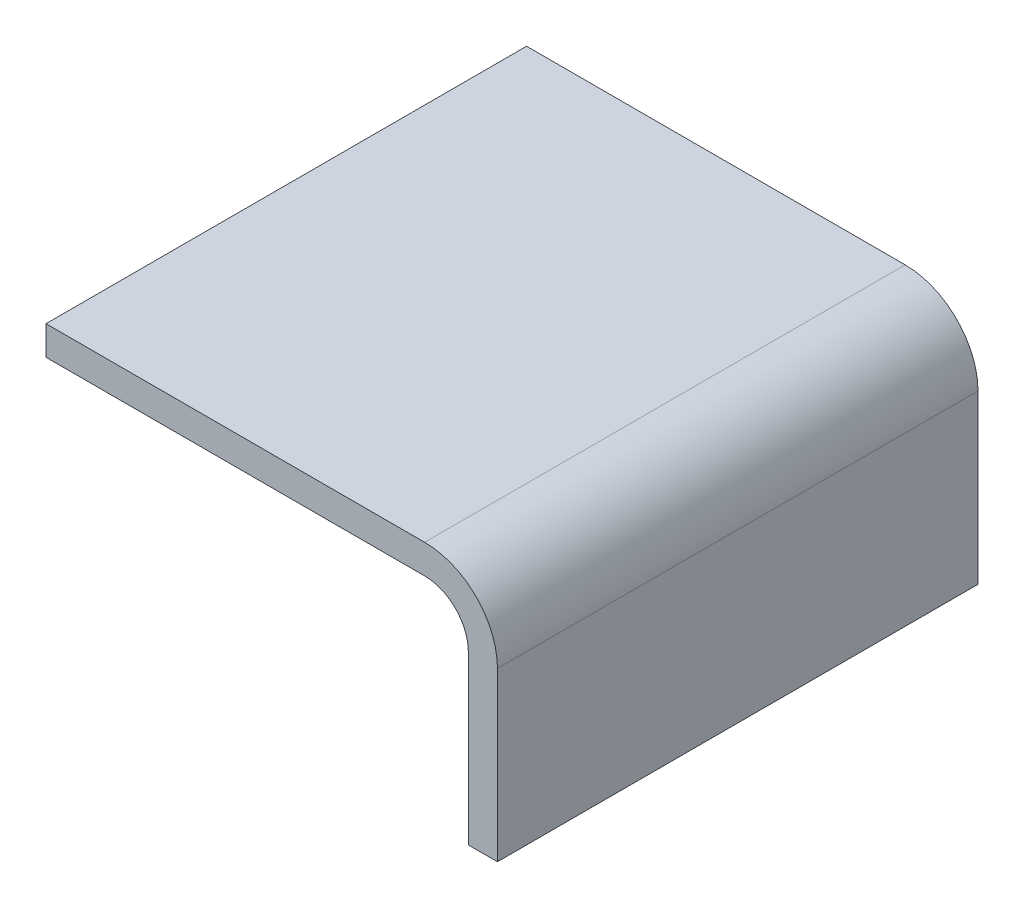
ISO-10303-21;
HEADER;
FILE_DESCRIPTION(('STEP AP214'),'2;1');
FILE_NAME('part.step','',(''),(''),'','','');
FILE_SCHEMA(('AUTOMOTIVE_DESIGN { 1 0 10303 214 1 1 1 1 }'));
ENDSEC;
DATA;
#1=APPLICATION_CONTEXT('core data for automotive mechanical design processes');
#2=APPLICATION_PROTOCOL_DEFINITION('international standard','automotive_design',2000,#1);
#3=PRODUCT_CONTEXT('',#1,'mechanical');
#4=PRODUCT('Part','Part','',(#3));
#5=PRODUCT_RELATED_PRODUCT_CATEGORY('part','',(#4));
#6=PRODUCT_DEFINITION_FORMATION('','',#4);
#7=PRODUCT_DEFINITION_CONTEXT('part definition',#1,'design');
#8=PRODUCT_DEFINITION('design','',#6,#7);
#9=PRODUCT_DEFINITION_SHAPE('','',#8);
#10=(LENGTH_UNIT() NAMED_UNIT(*) SI_UNIT(.MILLI.,.METRE.));
#11=(NAMED_UNIT(*) PLANE_ANGLE_UNIT() SI_UNIT($,.RADIAN.));
#12=(NAMED_UNIT(*) SI_UNIT($,.STERADIAN.) SOLID_ANGLE_UNIT());
#13=UNCERTAINTY_MEASURE_WITH_UNIT(LENGTH_MEASURE(1.E-05),#10,'distance_accuracy_value','');
#14=(GEOMETRIC_REPRESENTATION_CONTEXT(3) GLOBAL_UNCERTAINTY_ASSIGNED_CONTEXT((#13)) GLOBAL_UNIT_ASSIGNED_CONTEXT((#10,
#11,#12)) REPRESENTATION_CONTEXT('',''));
#15=CARTESIAN_POINT('',(0.,0.,0.));
#16=DIRECTION('',(0.,0.,1.));
#17=DIRECTION('',(1.,0.,0.));
#18=AXIS2_PLACEMENT_3D('',#15,#16,#17);
#19=CARTESIAN_POINT('',(52.,23.,66.));
#20=DIRECTION('',(0.,0.,-1.));
#21=DIRECTION('',(-1.,0.,0.));
#22=AXIS2_PLACEMENT_3D('',#19,#20,#21);
#23=CYLINDRICAL_SURFACE('',#22,10.);
#24=CARTESIAN_POINT('',(52.,23.,0.));
#25=DIRECTION('',(0.,0.,1.));
#26=DIRECTION('',(-1.,0.,0.));
#27=AXIS2_PLACEMENT_3D('',#24,#25,#26);
#28=CIRCLE('',#27,10.);
#29=CARTESIAN_POINT('',(62.,22.9999999999999,0.));
#30=VERTEX_POINT('',#29);
#31=CARTESIAN_POINT('',(51.9999999999999,33.,0.));
#32=VERTEX_POINT('',#31);
#33=EDGE_CURVE('E130',#30,#32,#28,.T.);
#34=ORIENTED_EDGE('',*,*,#33,.T.);
#35=DIRECTION('',(0.,0.,-1.));
#36=VECTOR('',#35,1.);
#37=CARTESIAN_POINT('',(51.9999999999999,33.,66.));
#38=LINE('',#37,#36);
#39=CARTESIAN_POINT('',(51.9999999999999,33.,66.));
#40=VERTEX_POINT('',#39);
#41=EDGE_CURVE('E11',#40,#32,#38,.T.);
#42=ORIENTED_EDGE('',*,*,#41,.F.);
#43=CARTESIAN_POINT('',(52.,23.,66.));
#44=DIRECTION('',(0.,0.,1.));
#45=DIRECTION('',(-1.,0.,0.));
#46=AXIS2_PLACEMENT_3D('',#43,#44,#45);
#47=CIRCLE('',#46,10.);
#48=CARTESIAN_POINT('',(62.,22.9999999999999,66.));
#49=VERTEX_POINT('',#48);
#50=EDGE_CURVE('E144',#49,#40,#47,.T.);
#51=ORIENTED_EDGE('',*,*,#50,.F.);
#52=DIRECTION('',(0.,0.,-1.));
#53=VECTOR('',#52,1.);
#54=CARTESIAN_POINT('',(62.,22.9999999999999,66.));
#55=LINE('',#54,#53);
#56=EDGE_CURVE('E126',#49,#30,#55,.T.);
#57=ORIENTED_EDGE('',*,*,#56,.T.);
#58=EDGE_LOOP('',(#34,#42,#51,#57));
#59=FACE_BOUND('',#58,.T.);
#60=ADVANCED_FACE('F34',(#59),#23,.T.);
#61=CARTESIAN_POINT('',(0.,33.,66.));
#62=DIRECTION('',(0.,-1.,0.));
#63=DIRECTION('',(0.,0.,-1.));
#64=AXIS2_PLACEMENT_3D('',#61,#62,#63);
#65=PLANE('',#64);
#66=DIRECTION('',(-1.,0.,0.));
#67=VECTOR('',#66,1.);
#68=CARTESIAN_POINT('',(0.,33.,0.));
#69=LINE('',#68,#67);
#70=CARTESIAN_POINT('',(0.,33.,0.));
#71=VERTEX_POINT('',#70);
#72=EDGE_CURVE('E133',#32,#71,#69,.T.);
#73=ORIENTED_EDGE('',*,*,#72,.T.);
#74=DIRECTION('',(0.,0.,-1.));
#75=VECTOR('',#74,1.);
#76=CARTESIAN_POINT('',(0.,33.,66.));
#77=LINE('',#76,#75);
#78=CARTESIAN_POINT('',(0.,33.,66.));
#79=VERTEX_POINT('',#78);
#80=EDGE_CURVE('E42',#79,#71,#77,.T.);
#81=ORIENTED_EDGE('',*,*,#80,.F.);
#82=DIRECTION('',(-1.,0.,0.));
#83=VECTOR('',#82,1.);
#84=CARTESIAN_POINT('',(0.,33.,66.));
#85=LINE('',#84,#83);
#86=EDGE_CURVE('E93',#40,#79,#85,.T.);
#87=ORIENTED_EDGE('',*,*,#86,.F.);
#88=ORIENTED_EDGE('',*,*,#41,.T.);
#89=EDGE_LOOP('',(#73,#81,#87,#88));
#90=FACE_BOUND('',#89,.T.);
#91=ADVANCED_FACE('F179',(#90),#65,.F.);
#92=CARTESIAN_POINT('',(0.,33.,66.));
#93=DIRECTION('',(1.,0.,0.));
#94=DIRECTION('',(0.,0.,-1.));
#95=AXIS2_PLACEMENT_3D('',#92,#93,#94);
#96=PLANE('',#95);
#97=DIRECTION('',(0.,-1.,0.));
#98=VECTOR('',#97,1.);
#99=CARTESIAN_POINT('',(0.,33.,0.));
#100=LINE('',#99,#98);
#101=CARTESIAN_POINT('',(0.,29.,0.));
#102=VERTEX_POINT('',#101);
#103=EDGE_CURVE('E135',#71,#102,#100,.T.);
#104=ORIENTED_EDGE('',*,*,#103,.T.);
#105=DIRECTION('',(0.,0.,-1.));
#106=VECTOR('',#105,1.);
#107=CARTESIAN_POINT('',(0.,29.,66.));
#108=LINE('',#107,#106);
#109=CARTESIAN_POINT('',(0.,29.,66.));
#110=VERTEX_POINT('',#109);
#111=EDGE_CURVE('E151',#110,#102,#108,.T.);
#112=ORIENTED_EDGE('',*,*,#111,.F.);
#113=DIRECTION('',(0.,-1.,0.));
#114=VECTOR('',#113,1.);
#115=CARTESIAN_POINT('',(0.,33.,66.));
#116=LINE('',#115,#114);
#117=EDGE_CURVE('E159',#79,#110,#116,.T.);
#118=ORIENTED_EDGE('',*,*,#117,.F.);
#119=ORIENTED_EDGE('',*,*,#80,.T.);
#120=EDGE_LOOP('',(#104,#112,#118,#119));
#121=FACE_BOUND('',#120,.T.);
#122=ADVANCED_FACE('F157',(#121),#96,.F.);
#123=CARTESIAN_POINT('',(0.,29.,66.));
#124=DIRECTION('',(0.,1.,0.));
#125=DIRECTION('',(0.,0.,1.));
#126=AXIS2_PLACEMENT_3D('',#123,#124,#125);
#127=PLANE('',#126);
#128=DIRECTION('',(1.,0.,0.));
#129=VECTOR('',#128,1.);
#130=CARTESIAN_POINT('',(0.,29.,0.));
#131=LINE('',#130,#129);
#132=CARTESIAN_POINT('',(51.9999999999999,29.,0.));
#133=VERTEX_POINT('',#132);
#134=EDGE_CURVE('E137',#102,#133,#131,.T.);
#135=ORIENTED_EDGE('',*,*,#134,.T.);
#136=DIRECTION('',(0.,0.,-1.));
#137=VECTOR('',#136,1.);
#138=CARTESIAN_POINT('',(51.9999999999999,29.,66.));
#139=LINE('',#138,#137);
#140=CARTESIAN_POINT('',(51.9999999999999,29.,66.));
#141=VERTEX_POINT('',#140);
#142=EDGE_CURVE('E148',#141,#133,#139,.T.);
#143=ORIENTED_EDGE('',*,*,#142,.F.);
#144=DIRECTION('',(1.,0.,0.));
#145=VECTOR('',#144,1.);
#146=CARTESIAN_POINT('',(0.,29.,66.));
#147=LINE('',#146,#145);
#148=EDGE_CURVE('E171',#110,#141,#147,.T.);
#149=ORIENTED_EDGE('',*,*,#148,.F.);
#150=ORIENTED_EDGE('',*,*,#111,.T.);
#151=EDGE_LOOP('',(#135,#143,#149,#150));
#152=FACE_BOUND('',#151,.T.);
#153=ADVANCED_FACE('F167',(#152),#127,.F.);
#154=CARTESIAN_POINT('',(52.,23.,66.));
#155=DIRECTION('',(0.,0.,-1.));
#156=DIRECTION('',(-1.,0.,0.));
#157=AXIS2_PLACEMENT_3D('',#154,#155,#156);
#158=CYLINDRICAL_SURFACE('',#157,6.);
#159=CARTESIAN_POINT('',(52.,23.,0.));
#160=DIRECTION('',(0.,0.,-1.));
#161=DIRECTION('',(-1.,0.,0.));
#162=AXIS2_PLACEMENT_3D('',#159,#160,#161);
#163=CIRCLE('',#162,6.);
#164=CARTESIAN_POINT('',(58.,23.,0.));
#165=VERTEX_POINT('',#164);
#166=EDGE_CURVE('E139',#133,#165,#163,.T.);
#167=ORIENTED_EDGE('',*,*,#166,.T.);
#168=DIRECTION('',(0.,0.,-1.));
#169=VECTOR('',#168,1.);
#170=CARTESIAN_POINT('',(58.,23.,66.));
#171=LINE('',#170,#169);
#172=CARTESIAN_POINT('',(58.,23.,66.));
#173=VERTEX_POINT('',#172);
#174=EDGE_CURVE('E121',#173,#165,#171,.T.);
#175=ORIENTED_EDGE('',*,*,#174,.F.);
#176=CARTESIAN_POINT('',(52.,23.,66.));
#177=DIRECTION('',(0.,0.,-1.));
#178=DIRECTION('',(-1.,0.,0.));
#179=AXIS2_PLACEMENT_3D('',#176,#177,#178);
#180=CIRCLE('',#179,6.);
#181=EDGE_CURVE('E112',#141,#173,#180,.T.);
#182=ORIENTED_EDGE('',*,*,#181,.F.);
#183=ORIENTED_EDGE('',*,*,#142,.T.);
#184=EDGE_LOOP('',(#167,#175,#182,#183));
#185=FACE_BOUND('',#184,.T.);
#186=ADVANCED_FACE('F170',(#185),#158,.F.);
#187=CARTESIAN_POINT('',(58.,0.,66.));
#188=DIRECTION('',(1.,0.,0.));
#189=DIRECTION('',(0.,1.,0.));
#190=AXIS2_PLACEMENT_3D('',#187,#188,#189);
#191=PLANE('',#190);
#192=DIRECTION('',(0.,-1.,0.));
#193=VECTOR('',#192,1.);
#194=CARTESIAN_POINT('',(58.,0.,0.));
#195=LINE('',#194,#193);
#196=CARTESIAN_POINT('',(58.,0.,0.));
#197=VERTEX_POINT('',#196);
#198=EDGE_CURVE('E120',#165,#197,#195,.T.);
#199=ORIENTED_EDGE('',*,*,#198,.T.);
#200=DIRECTION('',(0.,0.,-1.));
#201=VECTOR('',#200,1.);
#202=CARTESIAN_POINT('',(58.,0.,66.));
#203=LINE('',#202,#201);
#204=CARTESIAN_POINT('',(58.,0.,66.));
#205=VERTEX_POINT('',#204);
#206=EDGE_CURVE('E117',#205,#197,#203,.T.);
#207=ORIENTED_EDGE('',*,*,#206,.F.);
#208=DIRECTION('',(0.,-1.,0.));
#209=VECTOR('',#208,1.);
#210=CARTESIAN_POINT('',(58.,0.,66.));
#211=LINE('',#210,#209);
#212=EDGE_CURVE('E106',#173,#205,#211,.T.);
#213=ORIENTED_EDGE('',*,*,#212,.F.);
#214=ORIENTED_EDGE('',*,*,#174,.T.);
#215=EDGE_LOOP('',(#199,#207,#213,#214));
#216=FACE_BOUND('',#215,.T.);
#217=ADVANCED_FACE('F118',(#216),#191,.F.);
#218=CARTESIAN_POINT('',(62.,0.,66.));
#219=DIRECTION('',(0.,1.,0.));
#220=DIRECTION('',(0.,0.,1.));
#221=AXIS2_PLACEMENT_3D('',#218,#219,#220);
#222=PLANE('',#221);
#223=DIRECTION('',(1.,0.,0.));
#224=VECTOR('',#223,1.);
#225=CARTESIAN_POINT('',(62.,0.,0.));
#226=LINE('',#225,#224);
#227=CARTESIAN_POINT('',(62.,0.,0.));
#228=VERTEX_POINT('',#227);
#229=EDGE_CURVE('E79',#197,#228,#226,.T.);
#230=ORIENTED_EDGE('',*,*,#229,.T.);
#231=DIRECTION('',(0.,0.,-1.));
#232=VECTOR('',#231,1.);
#233=CARTESIAN_POINT('',(62.,0.,66.));
#234=LINE('',#233,#232);
#235=CARTESIAN_POINT('',(62.,0.,66.));
#236=VERTEX_POINT('',#235);
#237=EDGE_CURVE('E122',#236,#228,#234,.T.);
#238=ORIENTED_EDGE('',*,*,#237,.F.);
#239=DIRECTION('',(1.,0.,0.));
#240=VECTOR('',#239,1.);
#241=CARTESIAN_POINT('',(62.,0.,66.));
#242=LINE('',#241,#240);
#243=EDGE_CURVE('E110',#205,#236,#242,.T.);
#244=ORIENTED_EDGE('',*,*,#243,.F.);
#245=ORIENTED_EDGE('',*,*,#206,.T.);
#246=EDGE_LOOP('',(#230,#238,#244,#245));
#247=FACE_BOUND('',#246,.T.);
#248=ADVANCED_FACE('F124',(#247),#222,.F.);
#249=CARTESIAN_POINT('',(62.,0.,66.));
#250=DIRECTION('',(-1.,0.,0.));
#251=DIRECTION('',(0.,0.,1.));
#252=AXIS2_PLACEMENT_3D('',#249,#250,#251);
#253=PLANE('',#252);
#254=DIRECTION('',(0.,1.,0.));
#255=VECTOR('',#254,1.);
#256=CARTESIAN_POINT('',(62.,0.,0.));
#257=LINE('',#256,#255);
#258=EDGE_CURVE('E85',#228,#30,#257,.T.);
#259=ORIENTED_EDGE('',*,*,#258,.T.);
#260=ORIENTED_EDGE('',*,*,#56,.F.);
#261=DIRECTION('',(0.,1.,0.));
#262=VECTOR('',#261,1.);
#263=CARTESIAN_POINT('',(62.,0.,66.));
#264=LINE('',#263,#262);
#265=EDGE_CURVE('E50',#236,#49,#264,.T.);
#266=ORIENTED_EDGE('',*,*,#265,.F.);
#267=ORIENTED_EDGE('',*,*,#237,.T.);
#268=EDGE_LOOP('',(#259,#260,#266,#267));
#269=FACE_BOUND('',#268,.T.);
#270=ADVANCED_FACE('F195',(#269),#253,.F.);
#271=CARTESIAN_POINT('',(52.,23.,66.));
#272=DIRECTION('',(0.,0.,-1.));
#273=DIRECTION('',(-1.,0.,0.));
#274=AXIS2_PLACEMENT_3D('',#271,#272,#273);
#275=PLANE('',#274);
#276=ORIENTED_EDGE('',*,*,#50,.T.);
#277=ORIENTED_EDGE('',*,*,#86,.T.);
#278=ORIENTED_EDGE('',*,*,#117,.T.);
#279=ORIENTED_EDGE('',*,*,#148,.T.);
#280=ORIENTED_EDGE('',*,*,#181,.T.);
#281=ORIENTED_EDGE('',*,*,#212,.T.);
#282=ORIENTED_EDGE('',*,*,#243,.T.);
#283=ORIENTED_EDGE('',*,*,#265,.T.);
#284=EDGE_LOOP('',(#276,#277,#278,#279,#280,#281,#282,#283));
#285=FACE_BOUND('',#284,.T.);
#286=ADVANCED_FACE('F108',(#285),#275,.F.);
#287=CARTESIAN_POINT('',(52.,23.,0.));
#288=DIRECTION('',(0.,0.,-1.));
#289=DIRECTION('',(-1.,0.,0.));
#290=AXIS2_PLACEMENT_3D('',#287,#288,#289);
#291=PLANE('',#290);
#292=ORIENTED_EDGE('',*,*,#33,.F.);
#293=ORIENTED_EDGE('',*,*,#258,.F.);
#294=ORIENTED_EDGE('',*,*,#229,.F.);
#295=ORIENTED_EDGE('',*,*,#198,.F.);
#296=ORIENTED_EDGE('',*,*,#166,.F.);
#297=ORIENTED_EDGE('',*,*,#134,.F.);
#298=ORIENTED_EDGE('',*,*,#103,.F.);
#299=ORIENTED_EDGE('',*,*,#72,.F.);
#300=EDGE_LOOP('',(#292,#293,#294,#295,#296,#297,#298,#299));
#301=FACE_BOUND('',#300,.T.);
#302=ADVANCED_FACE('F163',(#301),#291,.T.);
#303=CLOSED_SHELL('',(#60,#91,#122,#153,#186,#217,#248,#270,#286,#302));
#304=MANIFOLD_SOLID_BREP('B2',#303);
#305=ADVANCED_BREP_SHAPE_REPRESENTATION('',(#18,#304),#14);
#306=SHAPE_DEFINITION_REPRESENTATION(#9,#305);
ENDSEC;
END-ISO-10303-21;
